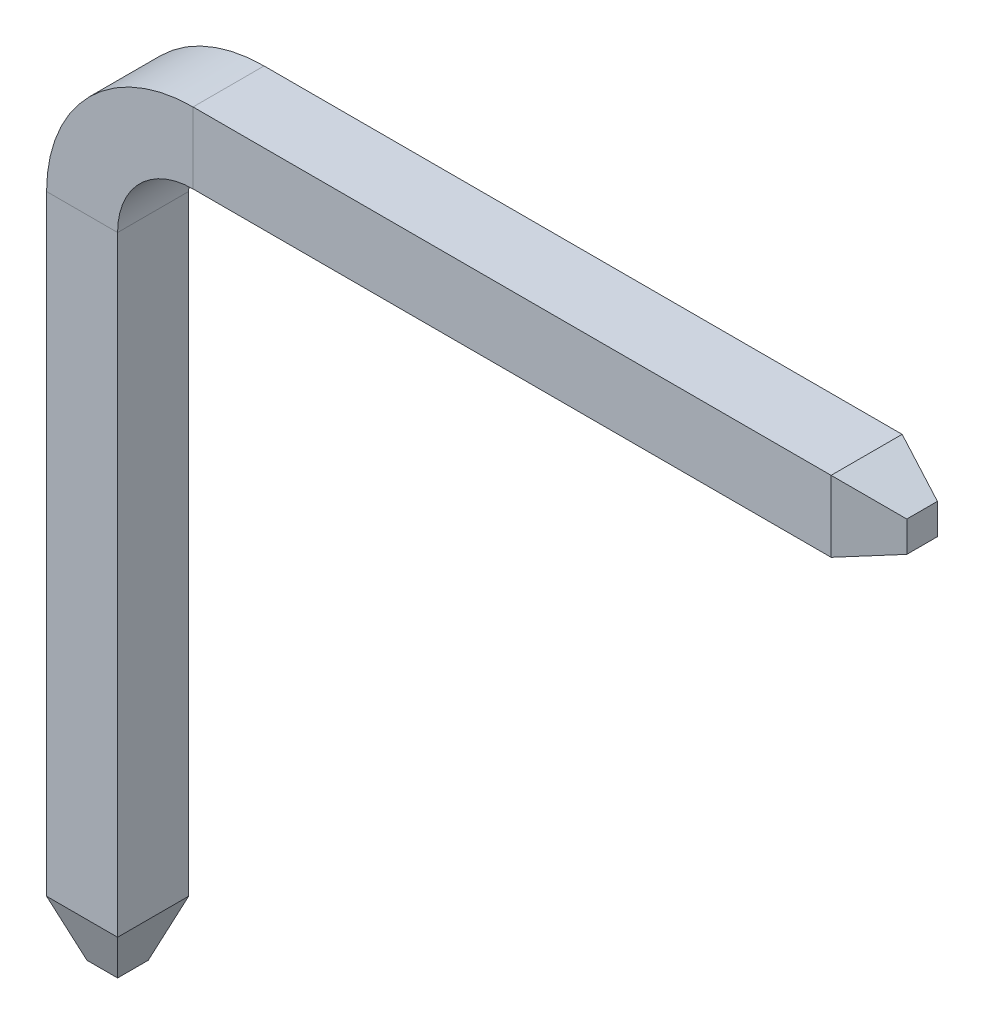
ISO-10303-21;
HEADER;
FILE_DESCRIPTION(('STEP AP214'),'2;1');
FILE_NAME('part.step','',(''),(''),'','','');
FILE_SCHEMA(('AUTOMOTIVE_DESIGN { 1 0 10303 214 1 1 1 1 }'));
ENDSEC;
DATA;
#1=APPLICATION_CONTEXT('core data for automotive mechanical design processes');
#2=APPLICATION_PROTOCOL_DEFINITION('international standard','automotive_design',2000,#1);
#3=PRODUCT_CONTEXT('',#1,'mechanical');
#4=PRODUCT('Part','Part','',(#3));
#5=PRODUCT_RELATED_PRODUCT_CATEGORY('part','',(#4));
#6=PRODUCT_DEFINITION_FORMATION('','',#4);
#7=PRODUCT_DEFINITION_CONTEXT('part definition',#1,'design');
#8=PRODUCT_DEFINITION('design','',#6,#7);
#9=PRODUCT_DEFINITION_SHAPE('','',#8);
#10=(LENGTH_UNIT() NAMED_UNIT(*) SI_UNIT(.MILLI.,.METRE.));
#11=(NAMED_UNIT(*) PLANE_ANGLE_UNIT() SI_UNIT($,.RADIAN.));
#12=(NAMED_UNIT(*) SI_UNIT($,.STERADIAN.) SOLID_ANGLE_UNIT());
#13=UNCERTAINTY_MEASURE_WITH_UNIT(LENGTH_MEASURE(1.E-05),#10,'distance_accuracy_value','');
#14=(GEOMETRIC_REPRESENTATION_CONTEXT(3) GLOBAL_UNCERTAINTY_ASSIGNED_CONTEXT((#13)) GLOBAL_UNIT_ASSIGNED_CONTEXT((#10,
#11,#12)) REPRESENTATION_CONTEXT('',''));
#15=CARTESIAN_POINT('',(0.,0.,0.));
#16=DIRECTION('',(0.,0.,1.));
#17=DIRECTION('',(1.,0.,0.));
#18=AXIS2_PLACEMENT_3D('',#15,#16,#17);
#19=CARTESIAN_POINT('',(0.,-4.25,0.));
#20=DIRECTION('',(0.,1.,0.));
#21=DIRECTION('',(0.,0.,1.));
#22=AXIS2_PLACEMENT_3D('',#19,#20,#21);
#23=PLANE('',#22);
#24=DIRECTION('',(0.,0.,-1.));
#25=VECTOR('',#24,1.);
#26=CARTESIAN_POINT('',(-0.138014882866898,-4.25,-0.32));
#27=LINE('',#26,#25);
#28=CARTESIAN_POINT('',(-0.138014882866898,-4.25,0.138014882866898));
#29=VERTEX_POINT('',#28);
#30=CARTESIAN_POINT('',(-0.138014882866898,-4.25,-0.138014882866898));
#31=VERTEX_POINT('',#30);
#32=EDGE_CURVE('E232',#29,#31,#27,.T.);
#33=ORIENTED_EDGE('',*,*,#32,.T.);
#34=DIRECTION('',(1.,0.,0.));
#35=VECTOR('',#34,1.);
#36=CARTESIAN_POINT('',(0.320000000000001,-4.25,-0.138014882866898));
#37=LINE('',#36,#35);
#38=CARTESIAN_POINT('',(0.138014882866899,-4.25,-0.138014882866898));
#39=VERTEX_POINT('',#38);
#40=EDGE_CURVE('E234',#31,#39,#37,.T.);
#41=ORIENTED_EDGE('',*,*,#40,.T.);
#42=DIRECTION('',(0.,0.,1.));
#43=VECTOR('',#42,1.);
#44=CARTESIAN_POINT('',(0.138014882866899,-4.25,0.32));
#45=LINE('',#44,#43);
#46=CARTESIAN_POINT('',(0.138014882866899,-4.25,0.138014882866898));
#47=VERTEX_POINT('',#46);
#48=EDGE_CURVE('E228',#39,#47,#45,.T.);
#49=ORIENTED_EDGE('',*,*,#48,.T.);
#50=DIRECTION('',(-1.,0.,0.));
#51=VECTOR('',#50,1.);
#52=CARTESIAN_POINT('',(-0.32,-4.25,0.138014882866898));
#53=LINE('',#52,#51);
#54=EDGE_CURVE('E230',#47,#29,#53,.T.);
#55=ORIENTED_EDGE('',*,*,#54,.T.);
#56=EDGE_LOOP('',(#33,#41,#49,#55));
#57=FACE_BOUND('',#56,.T.);
#58=ADVANCED_FACE('F36',(#57),#23,.F.);
#59=CARTESIAN_POINT('',(7.25,2.75,0.));
#60=DIRECTION('',(1.,0.,0.));
#61=DIRECTION('',(0.,0.,1.));
#62=AXIS2_PLACEMENT_3D('',#59,#60,#61);
#63=PLANE('',#62);
#64=DIRECTION('',(0.,0.,1.));
#65=VECTOR('',#64,1.);
#66=CARTESIAN_POINT('',(7.25,2.8880148828669,0.));
#67=LINE('',#66,#65);
#68=CARTESIAN_POINT('',(7.25,2.8880148828669,-0.138014882866898));
#69=VERTEX_POINT('',#68);
#70=CARTESIAN_POINT('',(7.25,2.8880148828669,0.138014882866898));
#71=VERTEX_POINT('',#70);
#72=EDGE_CURVE('E204',#69,#71,#67,.T.);
#73=ORIENTED_EDGE('',*,*,#72,.T.);
#74=DIRECTION('',(0.,-1.,0.));
#75=VECTOR('',#74,1.);
#76=CARTESIAN_POINT('',(7.25,2.75,0.138014882866898));
#77=LINE('',#76,#75);
#78=CARTESIAN_POINT('',(7.25,2.6119851171331,0.138014882866898));
#79=VERTEX_POINT('',#78);
#80=EDGE_CURVE('E206',#71,#79,#77,.T.);
#81=ORIENTED_EDGE('',*,*,#80,.T.);
#82=DIRECTION('',(0.,0.,-1.));
#83=VECTOR('',#82,1.);
#84=CARTESIAN_POINT('',(7.25,2.6119851171331,0.));
#85=LINE('',#84,#83);
#86=CARTESIAN_POINT('',(7.25,2.6119851171331,-0.138014882866898));
#87=VERTEX_POINT('',#86);
#88=EDGE_CURVE('E197',#79,#87,#85,.T.);
#89=ORIENTED_EDGE('',*,*,#88,.T.);
#90=DIRECTION('',(0.,1.,0.));
#91=VECTOR('',#90,1.);
#92=CARTESIAN_POINT('',(7.25,2.75,-0.138014882866898));
#93=LINE('',#92,#91);
#94=EDGE_CURVE('E202',#87,#69,#93,.T.);
#95=ORIENTED_EDGE('',*,*,#94,.T.);
#96=EDGE_LOOP('',(#73,#81,#89,#95));
#97=FACE_BOUND('',#96,.T.);
#98=ADVANCED_FACE('F289',(#97),#63,.T.);
#99=CARTESIAN_POINT('',(-0.32,-4.25,-0.32));
#100=DIRECTION('',(-1.,0.,0.));
#101=DIRECTION('',(0.,-1.,0.));
#102=AXIS2_PLACEMENT_3D('',#99,#100,#101);
#103=PLANE('',#102);
#104=DIRECTION('',(0.,1.,0.));
#105=VECTOR('',#104,1.);
#106=CARTESIAN_POINT('',(-0.32,-4.25,-0.32));
#107=LINE('',#106,#105);
#108=CARTESIAN_POINT('',(-0.32,-3.74999999999999,-0.32));
#109=VERTEX_POINT('',#108);
#110=CARTESIAN_POINT('',(-0.32,1.75,-0.32));
#111=VERTEX_POINT('',#110);
#112=EDGE_CURVE('E127',#109,#111,#107,.T.);
#113=ORIENTED_EDGE('',*,*,#112,.F.);
#114=DIRECTION('',(0.,0.,1.));
#115=VECTOR('',#114,1.);
#116=CARTESIAN_POINT('',(-0.32,-3.74999999999999,0.32));
#117=LINE('',#116,#115);
#118=CARTESIAN_POINT('',(-0.32,-3.74999999999999,0.32));
#119=VERTEX_POINT('',#118);
#120=EDGE_CURVE('E61',#109,#119,#117,.T.);
#121=ORIENTED_EDGE('',*,*,#120,.T.);
#122=DIRECTION('',(0.,1.,0.));
#123=VECTOR('',#122,1.);
#124=CARTESIAN_POINT('',(-0.32,-4.25,0.32));
#125=LINE('',#124,#123);
#126=CARTESIAN_POINT('',(-0.32,1.75,0.32));
#127=VERTEX_POINT('',#126);
#128=EDGE_CURVE('E137',#119,#127,#125,.T.);
#129=ORIENTED_EDGE('',*,*,#128,.T.);
#130=DIRECTION('',(0.,0.,1.));
#131=VECTOR('',#130,1.);
#132=CARTESIAN_POINT('',(-0.32,1.75,-0.32));
#133=LINE('',#132,#131);
#134=EDGE_CURVE('E147',#111,#127,#133,.T.);
#135=ORIENTED_EDGE('',*,*,#134,.F.);
#136=EDGE_LOOP('',(#113,#121,#129,#135));
#137=FACE_BOUND('',#136,.T.);
#138=ADVANCED_FACE('F159',(#137),#103,.T.);
#139=CARTESIAN_POINT('',(-0.32,-4.25,0.32));
#140=DIRECTION('',(0.,0.,1.));
#141=DIRECTION('',(1.,0.,0.));
#142=AXIS2_PLACEMENT_3D('',#139,#140,#141);
#143=PLANE('',#142);
#144=ORIENTED_EDGE('',*,*,#128,.F.);
#145=DIRECTION('',(1.,0.,0.));
#146=VECTOR('',#145,1.);
#147=CARTESIAN_POINT('',(0.320000000000001,-3.74999999999999,0.32));
#148=LINE('',#147,#146);
#149=CARTESIAN_POINT('',(0.320000000000001,-3.74999999999999,0.32));
#150=VERTEX_POINT('',#149);
#151=EDGE_CURVE('E46',#119,#150,#148,.T.);
#152=ORIENTED_EDGE('',*,*,#151,.T.);
#153=DIRECTION('',(0.,1.,0.));
#154=VECTOR('',#153,1.);
#155=CARTESIAN_POINT('',(0.320000000000001,-4.25,0.32));
#156=LINE('',#155,#154);
#157=CARTESIAN_POINT('',(0.32,1.75,0.32));
#158=VERTEX_POINT('',#157);
#159=EDGE_CURVE('E166',#150,#158,#156,.T.);
#160=ORIENTED_EDGE('',*,*,#159,.T.);
#161=DIRECTION('',(1.,0.,0.));
#162=VECTOR('',#161,1.);
#163=CARTESIAN_POINT('',(-0.32,1.75,0.32));
#164=LINE('',#163,#162);
#165=EDGE_CURVE('E161',#127,#158,#164,.T.);
#166=ORIENTED_EDGE('',*,*,#165,.F.);
#167=EDGE_LOOP('',(#144,#152,#160,#166));
#168=FACE_BOUND('',#167,.T.);
#169=ADVANCED_FACE('F360',(#168),#143,.T.);
#170=CARTESIAN_POINT('',(0.320000000000001,-4.25,-0.32));
#171=DIRECTION('',(1.,0.,0.));
#172=DIRECTION('',(0.,1.,0.));
#173=AXIS2_PLACEMENT_3D('',#170,#171,#172);
#174=PLANE('',#173);
#175=ORIENTED_EDGE('',*,*,#159,.F.);
#176=DIRECTION('',(0.,0.,-1.));
#177=VECTOR('',#176,1.);
#178=CARTESIAN_POINT('',(0.32,-3.74999999999999,-0.32));
#179=LINE('',#178,#177);
#180=CARTESIAN_POINT('',(0.32,-3.74999999999999,-0.32));
#181=VERTEX_POINT('',#180);
#182=EDGE_CURVE('E11',#150,#181,#179,.T.);
#183=ORIENTED_EDGE('',*,*,#182,.T.);
#184=DIRECTION('',(0.,1.,0.));
#185=VECTOR('',#184,1.);
#186=CARTESIAN_POINT('',(0.320000000000001,-4.25,-0.32));
#187=LINE('',#186,#185);
#188=CARTESIAN_POINT('',(0.32,1.75,-0.32));
#189=VERTEX_POINT('',#188);
#190=EDGE_CURVE('E162',#181,#189,#187,.T.);
#191=ORIENTED_EDGE('',*,*,#190,.T.);
#192=DIRECTION('',(0.,0.,-1.));
#193=VECTOR('',#192,1.);
#194=CARTESIAN_POINT('',(0.32,1.75,-0.32));
#195=LINE('',#194,#193);
#196=EDGE_CURVE('E157',#158,#189,#195,.T.);
#197=ORIENTED_EDGE('',*,*,#196,.F.);
#198=EDGE_LOOP('',(#175,#183,#191,#197));
#199=FACE_BOUND('',#198,.T.);
#200=ADVANCED_FACE('F363',(#199),#174,.T.);
#201=CARTESIAN_POINT('',(-0.32,-4.25,-0.32));
#202=DIRECTION('',(0.,0.,-1.));
#203=DIRECTION('',(-1.,0.,0.));
#204=AXIS2_PLACEMENT_3D('',#201,#202,#203);
#205=PLANE('',#204);
#206=ORIENTED_EDGE('',*,*,#190,.F.);
#207=DIRECTION('',(-1.,0.,0.));
#208=VECTOR('',#207,1.);
#209=CARTESIAN_POINT('',(-0.32,-3.74999999999999,-0.32));
#210=LINE('',#209,#208);
#211=EDGE_CURVE('E135',#181,#109,#210,.T.);
#212=ORIENTED_EDGE('',*,*,#211,.T.);
#213=ORIENTED_EDGE('',*,*,#112,.T.);
#214=DIRECTION('',(-1.,0.,0.));
#215=VECTOR('',#214,1.);
#216=CARTESIAN_POINT('',(-0.32,1.75,-0.32));
#217=LINE('',#216,#215);
#218=EDGE_CURVE('E132',#189,#111,#217,.T.);
#219=ORIENTED_EDGE('',*,*,#218,.F.);
#220=EDGE_LOOP('',(#206,#212,#213,#219));
#221=FACE_BOUND('',#220,.T.);
#222=ADVANCED_FACE('F130',(#221),#205,.T.);
#223=CARTESIAN_POINT('',(1.,1.75,0.));
#224=DIRECTION('',(0.,0.,-1.));
#225=DIRECTION('',(-1.,0.,0.));
#226=AXIS2_PLACEMENT_3D('',#223,#224,#225);
#227=CYLINDRICAL_SURFACE('',#226,1.32);
#228=CARTESIAN_POINT('',(1.,1.75,0.32));
#229=DIRECTION('',(0.,0.,-1.));
#230=DIRECTION('',(-1.,0.,0.));
#231=AXIS2_PLACEMENT_3D('',#228,#229,#230);
#232=CIRCLE('',#231,1.32);
#233=CARTESIAN_POINT('',(1.,3.07,0.32));
#234=VERTEX_POINT('',#233);
#235=EDGE_CURVE('E171',#127,#234,#232,.T.);
#236=ORIENTED_EDGE('',*,*,#235,.T.);
#237=DIRECTION('',(0.,0.,1.));
#238=VECTOR('',#237,1.);
#239=CARTESIAN_POINT('',(1.,3.07,-0.32));
#240=LINE('',#239,#238);
#241=CARTESIAN_POINT('',(1.,3.07,-0.32));
#242=VERTEX_POINT('',#241);
#243=EDGE_CURVE('E149',#242,#234,#240,.T.);
#244=ORIENTED_EDGE('',*,*,#243,.F.);
#245=CARTESIAN_POINT('',(1.,1.75,-0.32));
#246=DIRECTION('',(0.,0.,-1.));
#247=DIRECTION('',(-1.,0.,0.));
#248=AXIS2_PLACEMENT_3D('',#245,#246,#247);
#249=CIRCLE('',#248,1.32);
#250=EDGE_CURVE('E144',#111,#242,#249,.T.);
#251=ORIENTED_EDGE('',*,*,#250,.F.);
#252=ORIENTED_EDGE('',*,*,#134,.T.);
#253=EDGE_LOOP('',(#236,#244,#251,#252));
#254=FACE_BOUND('',#253,.T.);
#255=ADVANCED_FACE('F146',(#254),#227,.T.);
#256=CARTESIAN_POINT('',(-0.32,1.75,0.32));
#257=DIRECTION('',(0.,0.,1.));
#258=DIRECTION('',(1.,0.,0.));
#259=AXIS2_PLACEMENT_3D('',#256,#257,#258);
#260=PLANE('',#259);
#261=CARTESIAN_POINT('',(1.,1.75,0.32));
#262=DIRECTION('',(0.,0.,-1.));
#263=DIRECTION('',(-1.,0.,0.));
#264=AXIS2_PLACEMENT_3D('',#261,#262,#263);
#265=CIRCLE('',#264,0.68);
#266=CARTESIAN_POINT('',(1.,2.43,0.32));
#267=VERTEX_POINT('',#266);
#268=EDGE_CURVE('E185',#158,#267,#265,.T.);
#269=ORIENTED_EDGE('',*,*,#268,.T.);
#270=DIRECTION('',(0.,-1.,0.));
#271=VECTOR('',#270,1.);
#272=CARTESIAN_POINT('',(1.,3.07,0.32));
#273=LINE('',#272,#271);
#274=EDGE_CURVE('E172',#234,#267,#273,.T.);
#275=ORIENTED_EDGE('',*,*,#274,.F.);
#276=ORIENTED_EDGE('',*,*,#235,.F.);
#277=ORIENTED_EDGE('',*,*,#165,.T.);
#278=EDGE_LOOP('',(#269,#275,#276,#277));
#279=FACE_BOUND('',#278,.T.);
#280=ADVANCED_FACE('F344',(#279),#260,.T.);
#281=CARTESIAN_POINT('',(1.,1.75,0.));
#282=DIRECTION('',(0.,0.,-1.));
#283=DIRECTION('',(-1.,0.,0.));
#284=AXIS2_PLACEMENT_3D('',#281,#282,#283);
#285=CYLINDRICAL_SURFACE('',#284,0.68);
#286=CARTESIAN_POINT('',(1.,1.75,-0.32));
#287=DIRECTION('',(0.,0.,-1.));
#288=DIRECTION('',(-1.,0.,0.));
#289=AXIS2_PLACEMENT_3D('',#286,#287,#288);
#290=CIRCLE('',#289,0.68);
#291=CARTESIAN_POINT('',(1.,2.43,-0.32));
#292=VERTEX_POINT('',#291);
#293=EDGE_CURVE('E156',#189,#292,#290,.T.);
#294=ORIENTED_EDGE('',*,*,#293,.T.);
#295=DIRECTION('',(0.,0.,-1.));
#296=VECTOR('',#295,1.);
#297=CARTESIAN_POINT('',(1.,2.43,-0.32));
#298=LINE('',#297,#296);
#299=EDGE_CURVE('E188',#267,#292,#298,.T.);
#300=ORIENTED_EDGE('',*,*,#299,.F.);
#301=ORIENTED_EDGE('',*,*,#268,.F.);
#302=ORIENTED_EDGE('',*,*,#196,.T.);
#303=EDGE_LOOP('',(#294,#300,#301,#302));
#304=FACE_BOUND('',#303,.T.);
#305=ADVANCED_FACE('F340',(#304),#285,.F.);
#306=CARTESIAN_POINT('',(-0.32,1.75,-0.32));
#307=DIRECTION('',(0.,0.,-1.));
#308=DIRECTION('',(-1.,0.,0.));
#309=AXIS2_PLACEMENT_3D('',#306,#307,#308);
#310=PLANE('',#309);
#311=DIRECTION('',(0.,1.,0.));
#312=VECTOR('',#311,1.);
#313=CARTESIAN_POINT('',(1.,3.07,-0.32));
#314=LINE('',#313,#312);
#315=EDGE_CURVE('E180',#292,#242,#314,.T.);
#316=ORIENTED_EDGE('',*,*,#315,.F.);
#317=ORIENTED_EDGE('',*,*,#293,.F.);
#318=ORIENTED_EDGE('',*,*,#218,.T.);
#319=ORIENTED_EDGE('',*,*,#250,.T.);
#320=EDGE_LOOP('',(#316,#317,#318,#319));
#321=FACE_BOUND('',#320,.T.);
#322=ADVANCED_FACE('F154',(#321),#310,.T.);
#323=CARTESIAN_POINT('',(1.,3.07,-0.32));
#324=DIRECTION('',(0.,1.,0.));
#325=DIRECTION('',(0.,0.,1.));
#326=AXIS2_PLACEMENT_3D('',#323,#324,#325);
#327=PLANE('',#326);
#328=DIRECTION('',(1.,0.,0.));
#329=VECTOR('',#328,1.);
#330=CARTESIAN_POINT('',(1.,3.07,0.32));
#331=LINE('',#330,#329);
#332=CARTESIAN_POINT('',(6.74999999999999,3.07,0.32));
#333=VERTEX_POINT('',#332);
#334=EDGE_CURVE('E174',#234,#333,#331,.T.);
#335=ORIENTED_EDGE('',*,*,#334,.T.);
#336=DIRECTION('',(0.,0.,-1.));
#337=VECTOR('',#336,1.);
#338=CARTESIAN_POINT('',(6.74999999999999,3.07,-0.32));
#339=LINE('',#338,#337);
#340=CARTESIAN_POINT('',(6.74999999999999,3.07,-0.32));
#341=VERTEX_POINT('',#340);
#342=EDGE_CURVE('E212',#333,#341,#339,.T.);
#343=ORIENTED_EDGE('',*,*,#342,.T.);
#344=DIRECTION('',(1.,0.,0.));
#345=VECTOR('',#344,1.);
#346=CARTESIAN_POINT('',(1.,3.07,-0.32));
#347=LINE('',#346,#345);
#348=EDGE_CURVE('E178',#242,#341,#347,.T.);
#349=ORIENTED_EDGE('',*,*,#348,.F.);
#350=ORIENTED_EDGE('',*,*,#243,.T.);
#351=EDGE_LOOP('',(#335,#343,#349,#350));
#352=FACE_BOUND('',#351,.T.);
#353=ADVANCED_FACE('F349',(#352),#327,.T.);
#354=CARTESIAN_POINT('',(1.,3.07,0.32));
#355=DIRECTION('',(0.,0.,1.));
#356=DIRECTION('',(1.,0.,0.));
#357=AXIS2_PLACEMENT_3D('',#354,#355,#356);
#358=PLANE('',#357);
#359=DIRECTION('',(1.,0.,0.));
#360=VECTOR('',#359,1.);
#361=CARTESIAN_POINT('',(1.,2.43,0.32));
#362=LINE('',#361,#360);
#363=CARTESIAN_POINT('',(6.74999999999999,2.43,0.32));
#364=VERTEX_POINT('',#363);
#365=EDGE_CURVE('E177',#267,#364,#362,.T.);
#366=ORIENTED_EDGE('',*,*,#365,.T.);
#367=DIRECTION('',(0.,1.,0.));
#368=VECTOR('',#367,1.);
#369=CARTESIAN_POINT('',(6.74999999999999,3.07,0.32));
#370=LINE('',#369,#368);
#371=EDGE_CURVE('E209',#364,#333,#370,.T.);
#372=ORIENTED_EDGE('',*,*,#371,.T.);
#373=ORIENTED_EDGE('',*,*,#334,.F.);
#374=ORIENTED_EDGE('',*,*,#274,.T.);
#375=EDGE_LOOP('',(#366,#372,#373,#374));
#376=FACE_BOUND('',#375,.T.);
#377=ADVANCED_FACE('F283',(#376),#358,.T.);
#378=CARTESIAN_POINT('',(1.,2.43,-0.32));
#379=DIRECTION('',(0.,-1.,0.));
#380=DIRECTION('',(0.,0.,-1.));
#381=AXIS2_PLACEMENT_3D('',#378,#379,#380);
#382=PLANE('',#381);
#383=DIRECTION('',(1.,0.,0.));
#384=VECTOR('',#383,1.);
#385=CARTESIAN_POINT('',(1.,2.43,-0.32));
#386=LINE('',#385,#384);
#387=CARTESIAN_POINT('',(6.74999999999999,2.43,-0.32));
#388=VERTEX_POINT('',#387);
#389=EDGE_CURVE('E191',#292,#388,#386,.T.);
#390=ORIENTED_EDGE('',*,*,#389,.T.);
#391=DIRECTION('',(0.,0.,1.));
#392=VECTOR('',#391,1.);
#393=CARTESIAN_POINT('',(6.74999999999999,2.43,-0.32));
#394=LINE('',#393,#392);
#395=EDGE_CURVE('E216',#388,#364,#394,.T.);
#396=ORIENTED_EDGE('',*,*,#395,.T.);
#397=ORIENTED_EDGE('',*,*,#365,.F.);
#398=ORIENTED_EDGE('',*,*,#299,.T.);
#399=EDGE_LOOP('',(#390,#396,#397,#398));
#400=FACE_BOUND('',#399,.T.);
#401=ADVANCED_FACE('F273',(#400),#382,.T.);
#402=CARTESIAN_POINT('',(1.,3.07,-0.32));
#403=DIRECTION('',(0.,0.,-1.));
#404=DIRECTION('',(-1.,0.,0.));
#405=AXIS2_PLACEMENT_3D('',#402,#403,#404);
#406=PLANE('',#405);
#407=ORIENTED_EDGE('',*,*,#348,.T.);
#408=DIRECTION('',(0.,-1.,0.));
#409=VECTOR('',#408,1.);
#410=CARTESIAN_POINT('',(6.74999999999999,3.07,-0.32));
#411=LINE('',#410,#409);
#412=EDGE_CURVE('E214',#341,#388,#411,.T.);
#413=ORIENTED_EDGE('',*,*,#412,.T.);
#414=ORIENTED_EDGE('',*,*,#389,.F.);
#415=ORIENTED_EDGE('',*,*,#315,.T.);
#416=EDGE_LOOP('',(#407,#413,#414,#415));
#417=FACE_BOUND('',#416,.T.);
#418=ADVANCED_FACE('F270',(#417),#406,.T.);
#419=CARTESIAN_POINT('',(7.25,2.75,-0.138014882866898));
#420=DIRECTION('',(-0.342020143325666,0.,0.939692620785909));
#421=DIRECTION('',(0.,1.,0.));
#422=AXIS2_PLACEMENT_3D('',#419,#420,#421);
#423=PLANE('',#422);
#424=DIRECTION('',(0.88912649071599,0.323615577118183,0.323615577118183));
#425=VECTOR('',#424,1.);
#426=CARTESIAN_POINT('',(7.28971173749895,2.62643900753371,-0.123560992466287));
#427=LINE('',#426,#425);
#428=EDGE_CURVE('E222',#388,#87,#427,.T.);
#429=ORIENTED_EDGE('',*,*,#428,.F.);
#430=ORIENTED_EDGE('',*,*,#412,.F.);
#431=DIRECTION('',(0.88912649071599,-0.323615577118183,0.323615577118183));
#432=VECTOR('',#431,1.);
#433=CARTESIAN_POINT('',(7.28971173749895,2.87356099246629,-0.123560992466287));
#434=LINE('',#433,#432);
#435=EDGE_CURVE('E138',#69,#341,#434,.F.);
#436=ORIENTED_EDGE('',*,*,#435,.F.);
#437=ORIENTED_EDGE('',*,*,#94,.F.);
#438=EDGE_LOOP('',(#429,#430,#436,#437));
#439=FACE_BOUND('',#438,.T.);
#440=ADVANCED_FACE('F272',(#439),#423,.F.);
#441=CARTESIAN_POINT('',(7.25,2.8880148828669,0.));
#442=DIRECTION('',(-0.342020143325666,-0.939692620785909,0.));
#443=DIRECTION('',(0.,0.,1.));
#444=AXIS2_PLACEMENT_3D('',#441,#442,#443);
#445=PLANE('',#444);
#446=ORIENTED_EDGE('',*,*,#435,.T.);
#447=ORIENTED_EDGE('',*,*,#342,.F.);
#448=DIRECTION('',(0.88912649071599,-0.323615577118183,-0.323615577118183));
#449=VECTOR('',#448,1.);
#450=CARTESIAN_POINT('',(7.28971173749895,2.87356099246629,0.123560992466287));
#451=LINE('',#450,#449);
#452=EDGE_CURVE('E220',#71,#333,#451,.F.);
#453=ORIENTED_EDGE('',*,*,#452,.F.);
#454=ORIENTED_EDGE('',*,*,#72,.F.);
#455=EDGE_LOOP('',(#446,#447,#453,#454));
#456=FACE_BOUND('',#455,.T.);
#457=ADVANCED_FACE('F280',(#456),#445,.F.);
#458=CARTESIAN_POINT('',(7.25,2.6119851171331,0.));
#459=DIRECTION('',(-0.342020143325666,0.939692620785909,0.));
#460=DIRECTION('',(0.,0.,-1.));
#461=AXIS2_PLACEMENT_3D('',#458,#459,#460);
#462=PLANE('',#461);
#463=ORIENTED_EDGE('',*,*,#428,.T.);
#464=ORIENTED_EDGE('',*,*,#88,.F.);
#465=DIRECTION('',(-0.88912649071599,-0.323615577118183,0.323615577118183));
#466=VECTOR('',#465,1.);
#467=CARTESIAN_POINT('',(7.28971173749895,2.62643900753371,0.123560992466287));
#468=LINE('',#467,#466);
#469=EDGE_CURVE('E218',#364,#79,#468,.F.);
#470=ORIENTED_EDGE('',*,*,#469,.F.);
#471=ORIENTED_EDGE('',*,*,#395,.F.);
#472=EDGE_LOOP('',(#463,#464,#470,#471));
#473=FACE_BOUND('',#472,.T.);
#474=ADVANCED_FACE('F302',(#473),#462,.F.);
#475=CARTESIAN_POINT('',(7.25,2.75,0.138014882866898));
#476=DIRECTION('',(-0.342020143325666,0.,-0.939692620785909));
#477=DIRECTION('',(0.,-1.,0.));
#478=AXIS2_PLACEMENT_3D('',#475,#476,#477);
#479=PLANE('',#478);
#480=ORIENTED_EDGE('',*,*,#452,.T.);
#481=ORIENTED_EDGE('',*,*,#371,.F.);
#482=ORIENTED_EDGE('',*,*,#469,.T.);
#483=ORIENTED_EDGE('',*,*,#80,.F.);
#484=EDGE_LOOP('',(#480,#481,#482,#483));
#485=FACE_BOUND('',#484,.T.);
#486=ADVANCED_FACE('F296',(#485),#479,.F.);
#487=CARTESIAN_POINT('',(-0.32,-3.74999999999999,0.32));
#488=DIRECTION('',(0.,-0.342020143325666,0.939692620785909));
#489=DIRECTION('',(-1.,0.,0.));
#490=AXIS2_PLACEMENT_3D('',#487,#488,#489);
#491=PLANE('',#490);
#492=DIRECTION('',(0.323615577118183,-0.88912649071599,-0.323615577118183));
#493=VECTOR('',#492,1.);
#494=CARTESIAN_POINT('',(-0.32,-3.74999999999999,0.32));
#495=LINE('',#494,#493);
#496=EDGE_CURVE('E242',#29,#119,#495,.F.);
#497=ORIENTED_EDGE('',*,*,#496,.F.);
#498=ORIENTED_EDGE('',*,*,#54,.F.);
#499=DIRECTION('',(-0.323615577118183,-0.88912649071599,-0.323615577118183));
#500=VECTOR('',#499,1.);
#501=CARTESIAN_POINT('',(0.252974693277738,-3.93415051675143,0.252974693277738));
#502=LINE('',#501,#500);
#503=EDGE_CURVE('E41',#150,#47,#502,.T.);
#504=ORIENTED_EDGE('',*,*,#503,.F.);
#505=ORIENTED_EDGE('',*,*,#151,.F.);
#506=EDGE_LOOP('',(#497,#498,#504,#505));
#507=FACE_BOUND('',#506,.T.);
#508=ADVANCED_FACE('F39',(#507),#491,.T.);
#509=CARTESIAN_POINT('',(0.32,-3.74999999999999,-0.32));
#510=DIRECTION('',(0.939692620785909,-0.342020143325666,0.));
#511=DIRECTION('',(0.,0.,1.));
#512=AXIS2_PLACEMENT_3D('',#509,#510,#511);
#513=PLANE('',#512);
#514=ORIENTED_EDGE('',*,*,#503,.T.);
#515=ORIENTED_EDGE('',*,*,#48,.F.);
#516=DIRECTION('',(0.323615577118183,0.88912649071599,-0.323615577118183));
#517=VECTOR('',#516,1.);
#518=CARTESIAN_POINT('',(0.32,-3.74999999999999,-0.32));
#519=LINE('',#518,#517);
#520=EDGE_CURVE('E241',#181,#39,#519,.F.);
#521=ORIENTED_EDGE('',*,*,#520,.F.);
#522=ORIENTED_EDGE('',*,*,#182,.F.);
#523=EDGE_LOOP('',(#514,#515,#521,#522));
#524=FACE_BOUND('',#523,.T.);
#525=ADVANCED_FACE('F252',(#524),#513,.T.);
#526=CARTESIAN_POINT('',(-0.32,-3.74999999999999,-0.32));
#527=DIRECTION('',(-0.939692620785909,-0.342020143325666,0.));
#528=DIRECTION('',(0.,0.,-1.));
#529=AXIS2_PLACEMENT_3D('',#526,#527,#528);
#530=PLANE('',#529);
#531=ORIENTED_EDGE('',*,*,#496,.T.);
#532=ORIENTED_EDGE('',*,*,#120,.F.);
#533=DIRECTION('',(0.323615577118183,-0.88912649071599,0.323615577118183));
#534=VECTOR('',#533,1.);
#535=CARTESIAN_POINT('',(-0.32,-3.74999999999999,-0.32));
#536=LINE('',#535,#534);
#537=EDGE_CURVE('E239',#31,#109,#536,.F.);
#538=ORIENTED_EDGE('',*,*,#537,.F.);
#539=ORIENTED_EDGE('',*,*,#32,.F.);
#540=EDGE_LOOP('',(#531,#532,#538,#539));
#541=FACE_BOUND('',#540,.T.);
#542=ADVANCED_FACE('F261',(#541),#530,.T.);
#543=CARTESIAN_POINT('',(-0.32,-3.74999999999999,-0.32));
#544=DIRECTION('',(0.,-0.342020143325666,-0.939692620785909));
#545=DIRECTION('',(1.,0.,0.));
#546=AXIS2_PLACEMENT_3D('',#543,#544,#545);
#547=PLANE('',#546);
#548=ORIENTED_EDGE('',*,*,#520,.T.);
#549=ORIENTED_EDGE('',*,*,#40,.F.);
#550=ORIENTED_EDGE('',*,*,#537,.T.);
#551=ORIENTED_EDGE('',*,*,#211,.F.);
#552=EDGE_LOOP('',(#548,#549,#550,#551));
#553=FACE_BOUND('',#552,.T.);
#554=ADVANCED_FACE('F260',(#553),#547,.T.);
#555=CLOSED_SHELL('',(#58,#98,#138,#169,#200,#222,#255,#280,#305,#322,#353,#377,#401,#418,#440,
#457,#474,#486,#508,#525,#542,#554));
#556=MANIFOLD_SOLID_BREP('B2',#555);
#557=ADVANCED_BREP_SHAPE_REPRESENTATION('',(#18,#556),#14);
#558=SHAPE_DEFINITION_REPRESENTATION(#9,#557);
ENDSEC;
END-ISO-10303-21;
